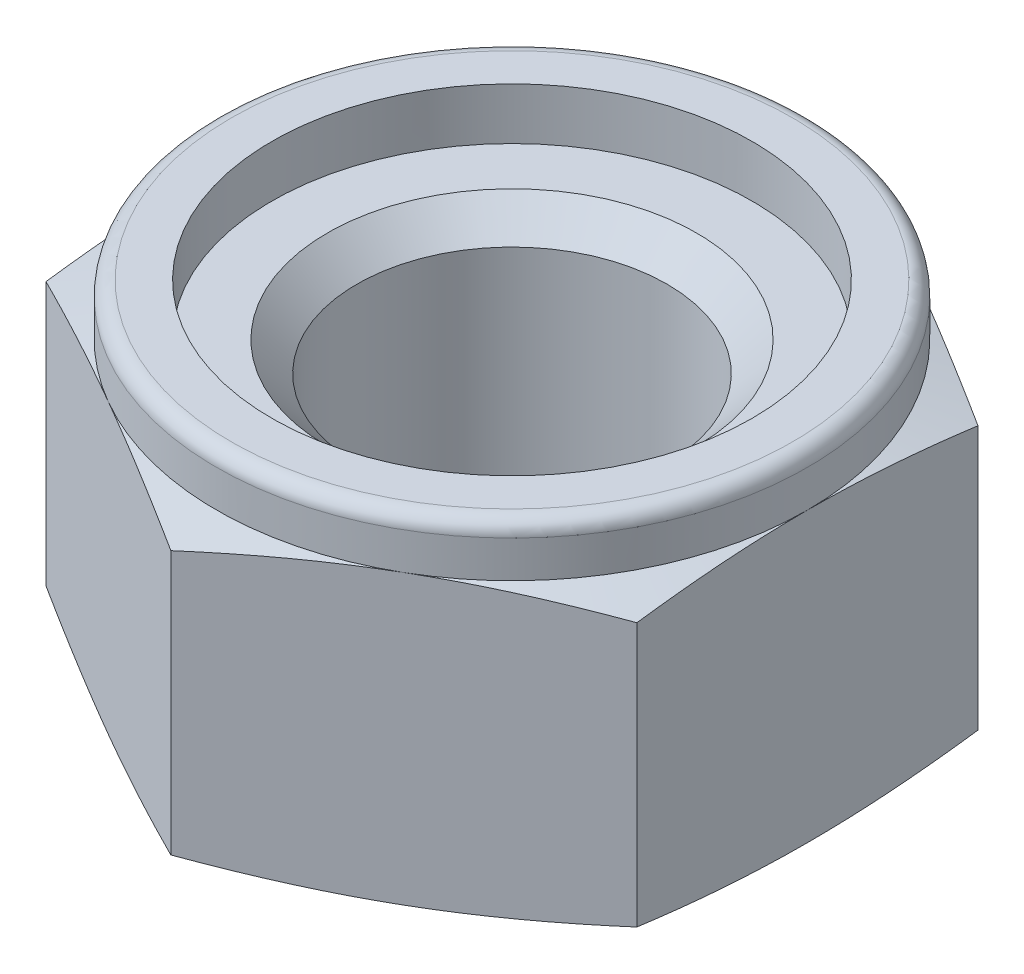
ISO-10303-21;
HEADER;
FILE_DESCRIPTION(('STEP AP214'),'2;1');
FILE_NAME('part.step','',(''),(''),'','','');
FILE_SCHEMA(('AUTOMOTIVE_DESIGN { 1 0 10303 214 1 1 1 1 }'));
ENDSEC;
DATA;
#1=APPLICATION_CONTEXT('core data for automotive mechanical design processes');
#2=APPLICATION_PROTOCOL_DEFINITION('international standard','automotive_design',2000,#1);
#3=PRODUCT_CONTEXT('',#1,'mechanical');
#4=PRODUCT('Part','Part','',(#3));
#5=PRODUCT_RELATED_PRODUCT_CATEGORY('part','',(#4));
#6=PRODUCT_DEFINITION_FORMATION('','',#4);
#7=PRODUCT_DEFINITION_CONTEXT('part definition',#1,'design');
#8=PRODUCT_DEFINITION('design','',#6,#7);
#9=PRODUCT_DEFINITION_SHAPE('','',#8);
#10=(LENGTH_UNIT() NAMED_UNIT(*) SI_UNIT(.MILLI.,.METRE.));
#11=(NAMED_UNIT(*) PLANE_ANGLE_UNIT() SI_UNIT($,.RADIAN.));
#12=(NAMED_UNIT(*) SI_UNIT($,.STERADIAN.) SOLID_ANGLE_UNIT());
#13=UNCERTAINTY_MEASURE_WITH_UNIT(LENGTH_MEASURE(1.E-05),#10,'distance_accuracy_value','');
#14=(GEOMETRIC_REPRESENTATION_CONTEXT(3) GLOBAL_UNCERTAINTY_ASSIGNED_CONTEXT((#13)) GLOBAL_UNIT_ASSIGNED_CONTEXT((#10,
#11,#12)) REPRESENTATION_CONTEXT('',''));
#15=CARTESIAN_POINT('',(0.,0.,0.));
#16=DIRECTION('',(0.,0.,1.));
#17=DIRECTION('',(1.,0.,0.));
#18=AXIS2_PLACEMENT_3D('',#15,#16,#17);
#19=CARTESIAN_POINT('',(4.,-3.9,-2.3094010767585));
#20=DIRECTION('',(0.5,0.,-0.866025403784439));
#21=DIRECTION('',(-0.866025403784439,0.,-0.5));
#22=AXIS2_PLACEMENT_3D('',#19,#20,#21);
#23=PLANE('',#22);
#24=DIRECTION('',(0.,1.,0.));
#25=VECTOR('',#24,1.);
#26=CARTESIAN_POINT('',(4.,-3.9,-2.3094010767585));
#27=LINE('',#26,#25);
#28=CARTESIAN_POINT('',(4.,-3.73419246269048,-2.3094010767585));
#29=VERTEX_POINT('',#28);
#30=CARTESIAN_POINT('',(4.,-0.165807537309517,-2.3094010767585));
#31=VERTEX_POINT('',#30);
#32=EDGE_CURVE('E159',#29,#31,#27,.T.);
#33=ORIENTED_EDGE('',*,*,#32,.F.);
#34=CARTESIAN_POINT('',(4.0002,-3.73416152142258,-2.30928560670467));
#35=CARTESIAN_POINT('',(3.83407348847834,-3.75987303025889,-2.40519879285123));
#36=CARTESIAN_POINT('',(3.66764575680637,-3.78321489853114,-2.50128588853266));
#37=CARTESIAN_POINT('',(3.33420250101888,-3.8242244457158,-2.69379944202103));
#38=CARTESIAN_POINT('',(3.16718676589026,-3.84188981954164,-2.79022602165644));
#39=CARTESIAN_POINT('',(2.83358019221101,-3.87051501923542,-2.98283386677359));
#40=CARTESIAN_POINT('',(2.66699160984345,-3.88150898419454,-3.07901382964742));
#41=CARTESIAN_POINT('',(2.33360198674029,-3.89625077349233,-3.27149641829105));
#42=CARTESIAN_POINT('',(2.16680099337015,-3.9,-3.3677990167144));
#43=CARTESIAN_POINT('',(1.83319900662985,-3.9,-3.56040421356111));
#44=CARTESIAN_POINT('',(1.66639801325971,-3.89625077349233,-3.65670681198446));
#45=CARTESIAN_POINT('',(1.33300839015655,-3.88150898419454,-3.84918940062809));
#46=CARTESIAN_POINT('',(1.16641980778899,-3.87051501923542,-3.94536936350192));
#47=CARTESIAN_POINT('',(0.832813234109738,-3.84188981954164,-4.13797720861907));
#48=CARTESIAN_POINT('',(0.665797498981121,-3.8242244457158,-4.23440378825448));
#49=CARTESIAN_POINT('',(0.332354243193628,-3.78321489853114,-4.42691734174285));
#50=CARTESIAN_POINT('',(0.165926511521663,-3.75987303025889,-4.52300443742428));
#51=CARTESIAN_POINT('',(-0.000199999999999005,-3.73416152142258,-4.61891762357084));
#52=B_SPLINE_CURVE_WITH_KNOTS('',3,(#34,#35,#36,#37,#38,#39,#40,#41,#42,#43,#44,#45,#46,#47,#48,
#49,#50,#51),.UNSPECIFIED.,.F.,.F.,(4,2,2,2,2,2,2,2,4),(0.,0.580655908162846,1.1615473094924,
1.73944052622642,2.31722188451987,2.89500324281333,3.47289645954735,4.0537878608769,
4.63444376903975),.UNSPECIFIED.);
#53=CARTESIAN_POINT('',(2.,-3.9,-3.46410161513775));
#54=VERTEX_POINT('',#53);
#55=EDGE_CURVE('E272',#29,#54,#52,.T.);
#56=ORIENTED_EDGE('',*,*,#55,.T.);
#57=CARTESIAN_POINT('',(0.,-3.73419246269048,-4.61880215351701));
#58=VERTEX_POINT('',#57);
#59=EDGE_CURVE('E57',#54,#58,#52,.T.);
#60=ORIENTED_EDGE('',*,*,#59,.T.);
#61=DIRECTION('',(0.,1.,0.));
#62=VECTOR('',#61,1.);
#63=CARTESIAN_POINT('',(0.,-3.9,-4.61880215351701));
#64=LINE('',#63,#62);
#65=CARTESIAN_POINT('',(0.,-0.165807537309517,-4.61880215351701));
#66=VERTEX_POINT('',#65);
#67=EDGE_CURVE('E390',#58,#66,#64,.T.);
#68=ORIENTED_EDGE('',*,*,#67,.T.);
#69=CARTESIAN_POINT('',(-0.000199999999999999,-0.165838478577418,-4.61891762357084));
#70=CARTESIAN_POINT('',(0.165926511521663,-0.140126969741107,-4.52300443742428));
#71=CARTESIAN_POINT('',(0.332354243193627,-0.116785101468864,-4.42691734174285));
#72=CARTESIAN_POINT('',(0.66579749898112,-0.075775554284197,-4.23440378825448));
#73=CARTESIAN_POINT('',(0.832813234109737,-0.0581101804583608,-4.13797720861907));
#74=CARTESIAN_POINT('',(1.16641980778899,-0.0294849807645812,-3.94536936350192));
#75=CARTESIAN_POINT('',(1.33300839015655,-0.01849101580546,-3.84918940062809));
#76=CARTESIAN_POINT('',(1.66639801325971,-0.00374922650766884,-3.65670681198446));
#77=CARTESIAN_POINT('',(1.83319900662985,0.,-3.56040421356111));
#78=CARTESIAN_POINT('',(2.16680099337015,0.,-3.3677990167144));
#79=CARTESIAN_POINT('',(2.33360198674029,-0.00374922650766877,-3.27149641829105));
#80=CARTESIAN_POINT('',(2.66699160984345,-0.0184910158054601,-3.07901382964742));
#81=CARTESIAN_POINT('',(2.83358019221101,-0.0294849807645813,-2.98283386677359));
#82=CARTESIAN_POINT('',(3.16718676589026,-0.0581101804583608,-2.79022602165644));
#83=CARTESIAN_POINT('',(3.33420250101888,-0.0757755542841968,-2.69379944202103));
#84=CARTESIAN_POINT('',(3.66764575680637,-0.116785101468864,-2.50128588853266));
#85=CARTESIAN_POINT('',(3.83407348847834,-0.140126969741107,-2.40519879285123));
#86=CARTESIAN_POINT('',(4.0002,-0.165838478577418,-2.30928560670467));
#87=B_SPLINE_CURVE_WITH_KNOTS('',3,(#69,#70,#71,#72,#73,#74,#75,#76,#77,#78,#79,#80,#81,#82,#83,
#84,#85,#86),.UNSPECIFIED.,.F.,.F.,(4,2,2,2,2,2,2,2,4),(0.,0.580655908162845,1.1615473094924,
1.73944052622642,2.31722188451987,2.89500324281333,3.47289645954735,4.0537878608769,
4.63444376903975),.UNSPECIFIED.);
#88=CARTESIAN_POINT('',(2.,0.,-3.46410161513775));
#89=VERTEX_POINT('',#88);
#90=EDGE_CURVE('E394',#66,#89,#87,.T.);
#91=ORIENTED_EDGE('',*,*,#90,.T.);
#92=EDGE_CURVE('E236',#89,#31,#87,.T.);
#93=ORIENTED_EDGE('',*,*,#92,.T.);
#94=EDGE_LOOP('',(#33,#56,#60,#68,#91,#93));
#95=FACE_BOUND('',#94,.T.);
#96=ADVANCED_FACE('F34',(#95),#23,.T.);
#97=CARTESIAN_POINT('',(4.,-3.9,2.3094010767585));
#98=DIRECTION('',(1.,0.,0.));
#99=DIRECTION('',(0.,0.,-1.));
#100=AXIS2_PLACEMENT_3D('',#97,#98,#99);
#101=PLANE('',#100);
#102=DIRECTION('',(0.,1.,0.));
#103=VECTOR('',#102,1.);
#104=CARTESIAN_POINT('',(4.,-3.9,2.3094010767585));
#105=LINE('',#104,#103);
#106=CARTESIAN_POINT('',(4.,-3.73419246269048,2.3094010767585));
#107=VERTEX_POINT('',#106);
#108=CARTESIAN_POINT('',(4.,-0.165807537309517,2.3094010767585));
#109=VERTEX_POINT('',#108);
#110=EDGE_CURVE('E131',#107,#109,#105,.T.);
#111=ORIENTED_EDGE('',*,*,#110,.F.);
#112=CARTESIAN_POINT('',(4.,-3.01595436953709,-6.10572086967074));
#113=CARTESIAN_POINT('',(4.,-3.05660785735266,-5.92429195794968));
#114=CARTESIAN_POINT('',(4.,-3.09676352877632,-5.74274954448039));
#115=CARTESIAN_POINT('',(4.,-3.17581062764326,-5.37938179680373));
#116=CARTESIAN_POINT('',(4.,-3.21470200037727,-5.19755645070899));
#117=CARTESIAN_POINT('',(4.,-3.29098583436686,-4.83340356135566));
#118=CARTESIAN_POINT('',(4.,-3.32837678341218,-4.65107570002296));
#119=CARTESIAN_POINT('',(4.,-3.40125525116772,-4.28604081191113));
#120=CARTESIAN_POINT('',(4.,-3.43674278597926,-4.10333378835298));
#121=CARTESIAN_POINT('',(4.,-3.50508822796062,-3.7389341343721));
#122=CARTESIAN_POINT('',(4.,-3.53796487116613,-3.55724505452428));
#123=CARTESIAN_POINT('',(4.,-3.60084155618723,-3.19337101971837));
#124=CARTESIAN_POINT('',(4.,-3.63084153129402,-3.01118605336155));
#125=CARTESIAN_POINT('',(4.,-3.71553129311669,-2.46383466451405));
#126=CARTESIAN_POINT('',(4.,-3.76492626374174,-2.09779291779679));
#127=CARTESIAN_POINT('',(4.,-3.8237333221464,-1.54498382603051));
#128=CARTESIAN_POINT('',(4.,-3.84084036468772,-1.35903266205509));
#129=CARTESIAN_POINT('',(4.,-3.86891366340535,-0.98666058237755));
#130=CARTESIAN_POINT('',(4.,-3.87988006040593,-0.800239677546552));
#131=CARTESIAN_POINT('',(4.,-3.89503571158575,-0.427202275547508));
#132=CARTESIAN_POINT('',(4.,-3.89922803288611,-0.240585905201729));
#133=CARTESIAN_POINT('',(4.,-3.90057695539164,0.13267284679997));
#134=CARTESIAN_POINT('',(4.,-3.89773356203681,0.319315228435666));
#135=CARTESIAN_POINT('',(4.,-3.88517131437763,0.693042882706222));
#136=CARTESIAN_POINT('',(4.,-3.87542750710641,0.880127299337181));
#137=CARTESIAN_POINT('',(4.,-3.84961980757283,1.25385559678635));
#138=CARTESIAN_POINT('',(4.,-3.83355577563893,1.44049946777717));
#139=CARTESIAN_POINT('',(4.,-3.79591975441154,1.81334570885039));
#140=CARTESIAN_POINT('',(4.,-3.7743441782302,1.99954771141548));
#141=CARTESIAN_POINT('',(4.,-3.72657602247871,2.3713510683107));
#142=CARTESIAN_POINT('',(4.,-3.70038342844518,2.55695242075736));
#143=CARTESIAN_POINT('',(4.,-3.61993667757263,3.08801452869602));
#144=CARTESIAN_POINT('',(4.,-3.56101970063747,3.43276550882737));
#145=CARTESIAN_POINT('',(4.,-3.43447150147252,4.12066388789736));
#146=CARTESIAN_POINT('',(4.,-3.36683917924609,4.46381107874073));
#147=CARTESIAN_POINT('',(4.,-3.22572117492553,5.14897682868291));
#148=CARTESIAN_POINT('',(4.,-3.1522340857243,5.49099509576764));
#149=CARTESIAN_POINT('',(4.,-3.00127531383369,6.17412330332495));
#150=CARTESIAN_POINT('',(4.,-2.92380386316252,6.51523329547449));
#151=CARTESIAN_POINT('',(4.,-2.7668350397813,7.19345355269296));
#152=CARTESIAN_POINT('',(4.,-2.68736505870511,7.53057018098002));
#153=CARTESIAN_POINT('',(4.,-2.52643428963016,8.20433309468715));
#154=CARTESIAN_POINT('',(4.,-2.44497346551579,8.54097937145737));
#155=CARTESIAN_POINT('',(4.,-2.28068211666776,9.2134980758963));
#156=CARTESIAN_POINT('',(4.,-2.19785339959774,9.54937094609798));
#157=CARTESIAN_POINT('',(4.,-2.03106409319372,10.2208239916289));
#158=CARTESIAN_POINT('',(4.,-1.94710354121405,10.5564041762304));
#159=CARTESIAN_POINT('',(4.,-1.86274197746043,10.8918823132006));
#160=B_SPLINE_CURVE_WITH_KNOTS('',3,(#112,#113,#114,#115,#116,#117,#118,#119,#120,#121,#122,
#123,#124,#125,#126,#127,#128,#129,#130,#131,#132,#133,#134,#135,#136,#137,#138,#139,#140,#141,
#142,#143,#144,#145,#146,#147,#148,#149,#150,#151,#152,#153,#154,#155,#156,#157,#158,#159),
.UNSPECIFIED.,.F.,.F.,(4,2,2,2,2,2,2,2,2,2,2,2,2,2,2,2,2,2,2,2,2,2,2,4),(0.,0.557785590390607,
1.11559528547674,1.67395373237497,2.23230745527376,2.78620241183816,3.34011020990258,
4.44768496330763,5.00781204660614,5.56792628390682,6.12778684525911,6.68764697372795,
7.24954204974875,7.81144954386674,8.37372366061136,8.93599953878234,9.98505029876087,
11.0342335933171,12.0836698087356,13.1330449821946,14.1721075065401,15.2111888943826,
16.2489924174028,17.2867617728858),.UNSPECIFIED.);
#161=CARTESIAN_POINT('',(4.,-3.9,0.));
#162=VERTEX_POINT('',#161);
#163=EDGE_CURVE('E252',#107,#162,#160,.F.);
#164=ORIENTED_EDGE('',*,*,#163,.T.);
#165=EDGE_CURVE('E49',#162,#29,#160,.F.);
#166=ORIENTED_EDGE('',*,*,#165,.T.);
#167=ORIENTED_EDGE('',*,*,#32,.T.);
#168=CARTESIAN_POINT('',(4.,-0.884045630462912,-6.10572086967074));
#169=CARTESIAN_POINT('',(4.,-0.84339214264734,-5.92429195794968));
#170=CARTESIAN_POINT('',(4.,-0.803236471223681,-5.74274954448039));
#171=CARTESIAN_POINT('',(4.,-0.724189372356739,-5.37938179680373));
#172=CARTESIAN_POINT('',(4.,-0.685297999622734,-5.19755645070899));
#173=CARTESIAN_POINT('',(4.,-0.609014165633139,-4.83340356135566));
#174=CARTESIAN_POINT('',(4.,-0.571623216587816,-4.65107570002296));
#175=CARTESIAN_POINT('',(4.,-0.49874474883228,-4.28604081191113));
#176=CARTESIAN_POINT('',(4.,-0.463257214020743,-4.10333378835298));
#177=CARTESIAN_POINT('',(4.,-0.394911772039382,-3.73893413437209));
#178=CARTESIAN_POINT('',(4.,-0.362035128833869,-3.55724505452428));
#179=CARTESIAN_POINT('',(4.,-0.299158443812768,-3.19337101971836));
#180=CARTESIAN_POINT('',(4.,-0.269158468705975,-3.01118605336155));
#181=CARTESIAN_POINT('',(4.,-0.184468706883313,-2.46383466451405));
#182=CARTESIAN_POINT('',(4.,-0.135073736258261,-2.09779291779679));
#183=CARTESIAN_POINT('',(4.,-0.0762666778535951,-1.54498382603051));
#184=CARTESIAN_POINT('',(4.,-0.0591596353122783,-1.35903266205509));
#185=CARTESIAN_POINT('',(4.,-0.0310863365946526,-0.986660582377549));
#186=CARTESIAN_POINT('',(4.,-0.0201199395940722,-0.800239677546551));
#187=CARTESIAN_POINT('',(4.,-0.00496428841424819,-0.427202275547507));
#188=CARTESIAN_POINT('',(4.,-0.000771967113889668,-0.240585905201728));
#189=CARTESIAN_POINT('',(4.,0.000576955391637953,0.13267284679997));
#190=CARTESIAN_POINT('',(4.,-0.00226643796318603,0.319315228435666));
#191=CARTESIAN_POINT('',(4.,-0.0148286856223665,0.693042882706222));
#192=CARTESIAN_POINT('',(4.,-0.0245724928935937,0.880127299337181));
#193=CARTESIAN_POINT('',(4.,-0.0503801924271709,1.25385559678635));
#194=CARTESIAN_POINT('',(4.,-0.0664442243610698,1.44049946777717));
#195=CARTESIAN_POINT('',(4.,-0.104080245588456,1.81334570885039));
#196=CARTESIAN_POINT('',(4.,-0.125655821769801,1.99954771141548));
#197=CARTESIAN_POINT('',(4.,-0.173423977521286,2.3713510683107));
#198=CARTESIAN_POINT('',(4.,-0.199616571554821,2.55695242075736));
#199=CARTESIAN_POINT('',(4.,-0.280063322427368,3.08801452869602));
#200=CARTESIAN_POINT('',(4.,-0.338980299362527,3.43276550882737));
#201=CARTESIAN_POINT('',(4.,-0.465528498527482,4.12066388789736));
#202=CARTESIAN_POINT('',(4.,-0.533160820753915,4.46381107874074));
#203=CARTESIAN_POINT('',(4.,-0.674278825074474,5.14897682868291));
#204=CARTESIAN_POINT('',(4.,-0.747765914275703,5.49099509576764));
#205=CARTESIAN_POINT('',(4.,-0.898724686166315,6.17412330332496));
#206=CARTESIAN_POINT('',(4.,-0.976196136837483,6.51523329547449));
#207=CARTESIAN_POINT('',(4.,-1.1331649602187,7.19345355269297));
#208=CARTESIAN_POINT('',(4.,-1.21263494129489,7.53057018098002));
#209=CARTESIAN_POINT('',(4.,-1.37356571036985,8.20433309468715));
#210=CARTESIAN_POINT('',(4.,-1.45502653448421,8.54097937145737));
#211=CARTESIAN_POINT('',(4.,-1.61931788333225,9.2134980758963));
#212=CARTESIAN_POINT('',(4.,-1.70214660040226,9.54937094609798));
#213=CARTESIAN_POINT('',(4.,-1.86893590680628,10.2208239916289));
#214=CARTESIAN_POINT('',(4.,-1.95289645878595,10.5564041762304));
#215=CARTESIAN_POINT('',(4.,-2.03725802253957,10.8918823132006));
#216=B_SPLINE_CURVE_WITH_KNOTS('',3,(#168,#169,#170,#171,#172,#173,#174,#175,#176,#177,#178,
#179,#180,#181,#182,#183,#184,#185,#186,#187,#188,#189,#190,#191,#192,#193,#194,#195,#196,#197,
#198,#199,#200,#201,#202,#203,#204,#205,#206,#207,#208,#209,#210,#211,#212,#213,#214,#215),
.UNSPECIFIED.,.F.,.F.,(4,2,2,2,2,2,2,2,2,2,2,2,2,2,2,2,2,2,2,2,2,2,2,4),(0.,0.557785590390607,
1.11559528547675,1.67395373237497,2.23230745527376,2.78620241183816,3.34011020990258,
4.44768496330763,5.00781204660614,5.56792628390682,6.12778684525911,6.68764697372795,
7.24954204974875,7.81144954386674,8.37372366061136,8.93599953878234,9.98505029876087,
11.0342335933171,12.0836698087356,13.1330449821946,14.1721075065401,15.2111888943826,
16.2489924174028,17.2867617728858),.UNSPECIFIED.);
#217=CARTESIAN_POINT('',(4.,0.,0.));
#218=VERTEX_POINT('',#217);
#219=EDGE_CURVE('E235',#31,#218,#216,.T.);
#220=ORIENTED_EDGE('',*,*,#219,.T.);
#221=EDGE_CURVE('E135',#218,#109,#216,.T.);
#222=ORIENTED_EDGE('',*,*,#221,.T.);
#223=EDGE_LOOP('',(#111,#164,#166,#167,#220,#222));
#224=FACE_BOUND('',#223,.T.);
#225=ADVANCED_FACE('F240',(#224),#101,.T.);
#226=CARTESIAN_POINT('',(0.,-3.9,4.618802153517));
#227=DIRECTION('',(0.5,0.,0.866025403784439));
#228=DIRECTION('',(0.866025403784439,0.,-0.5));
#229=AXIS2_PLACEMENT_3D('',#226,#227,#228);
#230=PLANE('',#229);
#231=DIRECTION('',(0.,1.,0.));
#232=VECTOR('',#231,1.);
#233=CARTESIAN_POINT('',(0.,-3.9,4.618802153517));
#234=LINE('',#233,#232);
#235=CARTESIAN_POINT('',(0.,-3.73419246269048,4.61880215351701));
#236=VERTEX_POINT('',#235);
#237=CARTESIAN_POINT('',(0.,-0.165807537309517,4.61880215351701));
#238=VERTEX_POINT('',#237);
#239=EDGE_CURVE('E392',#236,#238,#234,.T.);
#240=ORIENTED_EDGE('',*,*,#239,.F.);
#241=CARTESIAN_POINT('',(-0.000200000000001787,-3.73416152142258,4.61891762357084));
#242=CARTESIAN_POINT('',(0.165926511521661,-3.75987303025889,4.52300443742428));
#243=CARTESIAN_POINT('',(0.332354243193626,-3.78321489853114,4.42691734174285));
#244=CARTESIAN_POINT('',(0.665797498981118,-3.8242244457158,4.23440378825448));
#245=CARTESIAN_POINT('',(0.832813234109735,-3.84188981954164,4.13797720861907));
#246=CARTESIAN_POINT('',(1.16641980778899,-3.87051501923542,3.94536936350192));
#247=CARTESIAN_POINT('',(1.33300839015655,-3.88150898419454,3.84918940062809));
#248=CARTESIAN_POINT('',(1.66639801325971,-3.89625077349233,3.65670681198446));
#249=CARTESIAN_POINT('',(1.83319900662985,-3.9,3.5604042135611));
#250=CARTESIAN_POINT('',(2.16680099337015,-3.9,3.3677990167144));
#251=CARTESIAN_POINT('',(2.33360198674029,-3.89625077349233,3.27149641829105));
#252=CARTESIAN_POINT('',(2.66699160984345,-3.88150898419454,3.07901382964742));
#253=CARTESIAN_POINT('',(2.83358019221101,-3.87051501923542,2.98283386677359));
#254=CARTESIAN_POINT('',(3.16718676589026,-3.84188981954164,2.79022602165644));
#255=CARTESIAN_POINT('',(3.33420250101888,-3.8242244457158,2.69379944202103));
#256=CARTESIAN_POINT('',(3.66764575680637,-3.78321489853114,2.50128588853266));
#257=CARTESIAN_POINT('',(3.83407348847834,-3.75987303025889,2.40519879285123));
#258=CARTESIAN_POINT('',(4.0002,-3.73416152142258,2.30928560670467));
#259=B_SPLINE_CURVE_WITH_KNOTS('',3,(#241,#242,#243,#244,#245,#246,#247,#248,#249,#250,#251,
#252,#253,#254,#255,#256,#257,#258),.UNSPECIFIED.,.F.,.F.,(4,2,2,2,2,2,2,2,4),(0.,
0.580655908162845,1.1615473094924,1.73944052622642,2.31722188451988,2.89500324281333,
3.47289645954735,4.0537878608769,4.63444376903975),.UNSPECIFIED.);
#260=CARTESIAN_POINT('',(2.,-3.9,3.46410161513776));
#261=VERTEX_POINT('',#260);
#262=EDGE_CURVE('E152',#236,#261,#259,.T.);
#263=ORIENTED_EDGE('',*,*,#262,.T.);
#264=EDGE_CURVE('E258',#261,#107,#259,.T.);
#265=ORIENTED_EDGE('',*,*,#264,.T.);
#266=ORIENTED_EDGE('',*,*,#110,.T.);
#267=CARTESIAN_POINT('',(4.0002,-0.165838478577418,2.30928560670467));
#268=CARTESIAN_POINT('',(3.83407348847834,-0.140126969741107,2.40519879285123));
#269=CARTESIAN_POINT('',(3.66764575680637,-0.116785101468863,2.50128588853266));
#270=CARTESIAN_POINT('',(3.33420250101888,-0.0757755542841966,2.69379944202103));
#271=CARTESIAN_POINT('',(3.16718676589026,-0.0581101804583607,2.79022602165644));
#272=CARTESIAN_POINT('',(2.83358019221101,-0.0294849807645811,2.98283386677359));
#273=CARTESIAN_POINT('',(2.66699160984345,-0.0184910158054597,3.07901382964742));
#274=CARTESIAN_POINT('',(2.33360198674029,-0.00374922650766824,3.27149641829105));
#275=CARTESIAN_POINT('',(2.16680099337015,0.,3.3677990167144));
#276=CARTESIAN_POINT('',(1.83319900662985,0.,3.5604042135611));
#277=CARTESIAN_POINT('',(1.66639801325971,-0.0037492265076684,3.65670681198446));
#278=CARTESIAN_POINT('',(1.33300839015655,-0.0184910158054597,3.84918940062809));
#279=CARTESIAN_POINT('',(1.16641980778899,-0.0294849807645809,3.94536936350192));
#280=CARTESIAN_POINT('',(0.832813234109736,-0.0581101804583603,4.13797720861907));
#281=CARTESIAN_POINT('',(0.665797498981119,-0.0757755542841963,4.23440378825448));
#282=CARTESIAN_POINT('',(0.332354243193626,-0.116785101468863,4.42691734174285));
#283=CARTESIAN_POINT('',(0.165926511521661,-0.140126969741107,4.52300443742428));
#284=CARTESIAN_POINT('',(-0.00020000000000141,-0.165838478577418,4.61891762357084));
#285=B_SPLINE_CURVE_WITH_KNOTS('',3,(#267,#268,#269,#270,#271,#272,#273,#274,#275,#276,#277,
#278,#279,#280,#281,#282,#283,#284),.UNSPECIFIED.,.F.,.F.,(4,2,2,2,2,2,2,2,4),(0.,
0.580655908162846,1.1615473094924,1.73944052622642,2.31722188451988,2.89500324281333,
3.47289645954735,4.0537878608769,4.63444376903975),.UNSPECIFIED.);
#286=CARTESIAN_POINT('',(2.,0.,3.46410161513776));
#287=VERTEX_POINT('',#286);
#288=EDGE_CURVE('E124',#109,#287,#285,.T.);
#289=ORIENTED_EDGE('',*,*,#288,.T.);
#290=EDGE_CURVE('E128',#287,#238,#285,.T.);
#291=ORIENTED_EDGE('',*,*,#290,.T.);
#292=EDGE_LOOP('',(#240,#263,#265,#266,#289,#291));
#293=FACE_BOUND('',#292,.T.);
#294=ADVANCED_FACE('F127',(#293),#230,.T.);
#295=CARTESIAN_POINT('',(-4.,-3.9,2.3094010767585));
#296=DIRECTION('',(-0.5,0.,0.866025403784438));
#297=DIRECTION('',(0.866025403784439,0.,0.5));
#298=AXIS2_PLACEMENT_3D('',#295,#296,#297);
#299=PLANE('',#298);
#300=DIRECTION('',(0.,1.,0.));
#301=VECTOR('',#300,1.);
#302=CARTESIAN_POINT('',(-4.,-3.9,2.3094010767585));
#303=LINE('',#302,#301);
#304=CARTESIAN_POINT('',(-4.,-3.73419246269048,2.3094010767585));
#305=VERTEX_POINT('',#304);
#306=CARTESIAN_POINT('',(-4.,-0.165807537309517,2.3094010767585));
#307=VERTEX_POINT('',#306);
#308=EDGE_CURVE('E389',#305,#307,#303,.T.);
#309=ORIENTED_EDGE('',*,*,#308,.F.);
#310=CARTESIAN_POINT('',(-4.0002,-3.73416152142258,2.30928560670466));
#311=CARTESIAN_POINT('',(-3.83407348847834,-3.75987303025889,2.40519879285123));
#312=CARTESIAN_POINT('',(-3.66764575680637,-3.78321489853114,2.50128588853266));
#313=CARTESIAN_POINT('',(-3.33420250101888,-3.8242244457158,2.69379944202103));
#314=CARTESIAN_POINT('',(-3.16718676589026,-3.84188981954164,2.79022602165644));
#315=CARTESIAN_POINT('',(-2.83358019221101,-3.87051501923542,2.98283386677359));
#316=CARTESIAN_POINT('',(-2.66699160984345,-3.88150898419454,3.07901382964742));
#317=CARTESIAN_POINT('',(-2.33360198674029,-3.89625077349233,3.27149641829105));
#318=CARTESIAN_POINT('',(-2.16680099337015,-3.9,3.3677990167144));
#319=CARTESIAN_POINT('',(-1.83319900662985,-3.9,3.5604042135611));
#320=CARTESIAN_POINT('',(-1.66639801325971,-3.89625077349233,3.65670681198446));
#321=CARTESIAN_POINT('',(-1.33300839015655,-3.88150898419454,3.84918940062809));
#322=CARTESIAN_POINT('',(-1.16641980778899,-3.87051501923542,3.94536936350192));
#323=CARTESIAN_POINT('',(-0.832813234109739,-3.84188981954164,4.13797720861907));
#324=CARTESIAN_POINT('',(-0.665797498981122,-3.8242244457158,4.23440378825448));
#325=CARTESIAN_POINT('',(-0.332354243193629,-3.78321489853114,4.42691734174285));
#326=CARTESIAN_POINT('',(-0.165926511521665,-3.75987303025889,4.52300443742428));
#327=CARTESIAN_POINT('',(0.000199999999997752,-3.73416152142258,4.61891762357084));
#328=B_SPLINE_CURVE_WITH_KNOTS('',3,(#310,#311,#312,#313,#314,#315,#316,#317,#318,#319,#320,
#321,#322,#323,#324,#325,#326,#327),.UNSPECIFIED.,.F.,.F.,(4,2,2,2,2,2,2,2,4),(0.,
0.580655908162845,1.1615473094924,1.73944052622642,2.31722188451987,2.89500324281333,
3.47289645954735,4.0537878608769,4.63444376903975),.UNSPECIFIED.);
#329=CARTESIAN_POINT('',(-2.,-3.9,3.46410161513775));
#330=VERTEX_POINT('',#329);
#331=EDGE_CURVE('E253',#305,#330,#328,.T.);
#332=ORIENTED_EDGE('',*,*,#331,.T.);
#333=EDGE_CURVE('E262',#330,#236,#328,.T.);
#334=ORIENTED_EDGE('',*,*,#333,.T.);
#335=ORIENTED_EDGE('',*,*,#239,.T.);
#336=CARTESIAN_POINT('',(0.000199999999998244,-0.165838478577418,4.61891762357084));
#337=CARTESIAN_POINT('',(-0.165926511521665,-0.140126969741107,4.52300443742428));
#338=CARTESIAN_POINT('',(-0.332354243193629,-0.116785101468864,4.42691734174285));
#339=CARTESIAN_POINT('',(-0.665797498981122,-0.0757755542841967,4.23440378825448));
#340=CARTESIAN_POINT('',(-0.832813234109739,-0.0581101804583606,4.13797720861907));
#341=CARTESIAN_POINT('',(-1.16641980778899,-0.0294849807645811,3.94536936350192));
#342=CARTESIAN_POINT('',(-1.33300839015655,-0.0184910158054597,3.84918940062809));
#343=CARTESIAN_POINT('',(-1.66639801325971,-0.00374922650766844,3.65670681198446));
#344=CARTESIAN_POINT('',(-1.83319900662985,0.,3.5604042135611));
#345=CARTESIAN_POINT('',(-2.16680099337015,0.,3.3677990167144));
#346=CARTESIAN_POINT('',(-2.33360198674029,-0.00374922650766864,3.27149641829105));
#347=CARTESIAN_POINT('',(-2.66699160984345,-0.01849101580546,3.07901382964742));
#348=CARTESIAN_POINT('',(-2.83358019221101,-0.0294849807645813,2.98283386677359));
#349=CARTESIAN_POINT('',(-3.16718676589026,-0.0581101804583608,2.79022602165644));
#350=CARTESIAN_POINT('',(-3.33420250101888,-0.0757755542841969,2.69379944202103));
#351=CARTESIAN_POINT('',(-3.66764575680637,-0.116785101468864,2.50128588853266));
#352=CARTESIAN_POINT('',(-3.83407348847834,-0.140126969741107,2.40519879285123));
#353=CARTESIAN_POINT('',(-4.0002,-0.165838478577418,2.30928560670466));
#354=B_SPLINE_CURVE_WITH_KNOTS('',3,(#336,#337,#338,#339,#340,#341,#342,#343,#344,#345,#346,
#347,#348,#349,#350,#351,#352,#353),.UNSPECIFIED.,.F.,.F.,(4,2,2,2,2,2,2,2,4),(0.,
0.580655908162845,1.1615473094924,1.73944052622642,2.31722188451987,2.89500324281333,
3.47289645954735,4.0537878608769,4.63444376903975),.UNSPECIFIED.);
#355=CARTESIAN_POINT('',(-2.,0.,3.46410161513775));
#356=VERTEX_POINT('',#355);
#357=EDGE_CURVE('E144',#238,#356,#354,.T.);
#358=ORIENTED_EDGE('',*,*,#357,.T.);
#359=EDGE_CURVE('E221',#356,#307,#354,.T.);
#360=ORIENTED_EDGE('',*,*,#359,.T.);
#361=EDGE_LOOP('',(#309,#332,#334,#335,#358,#360));
#362=FACE_BOUND('',#361,.T.);
#363=ADVANCED_FACE('F380',(#362),#299,.T.);
#364=CARTESIAN_POINT('',(-4.,-3.9,-2.3094010767585));
#365=DIRECTION('',(-1.,0.,0.));
#366=DIRECTION('',(0.,0.,1.));
#367=AXIS2_PLACEMENT_3D('',#364,#365,#366);
#368=PLANE('',#367);
#369=DIRECTION('',(0.,1.,0.));
#370=VECTOR('',#369,1.);
#371=CARTESIAN_POINT('',(-4.,-3.9,-2.3094010767585));
#372=LINE('',#371,#370);
#373=CARTESIAN_POINT('',(-4.,-3.73419246269048,-2.3094010767585));
#374=VERTEX_POINT('',#373);
#375=CARTESIAN_POINT('',(-4.,-0.165807537309517,-2.3094010767585));
#376=VERTEX_POINT('',#375);
#377=EDGE_CURVE('E187',#374,#376,#372,.T.);
#378=ORIENTED_EDGE('',*,*,#377,.F.);
#379=CARTESIAN_POINT('',(-4.,-3.01595446137486,-6.10572045992604));
#380=CARTESIAN_POINT('',(-4.,-3.05660794466169,-5.92429156476436));
#381=CARTESIAN_POINT('',(-4.,-3.09676361157307,-5.74274916786053));
#382=CARTESIAN_POINT('',(-4.,-3.17581070148241,-5.37938145333641));
#383=CARTESIAN_POINT('',(-4.,-3.2147020697711,-5.19755612382875));
#384=CARTESIAN_POINT('',(-4.,-3.29098589495891,-4.83340326773456));
#385=CARTESIAN_POINT('',(-4.,-3.3283768396482,-4.65107542307401));
#386=CARTESIAN_POINT('',(-4.,-3.40125529885012,-4.28604056834793));
#387=CARTESIAN_POINT('',(-4.,-3.43674282946407,-4.10333356150337));
#388=CARTESIAN_POINT('',(-4.,-3.50508826337908,-3.73893394056794));
#389=CARTESIAN_POINT('',(-4.,-3.53796490271002,-3.55724487705079));
#390=CARTESIAN_POINT('',(-4.,-3.60084158032241,-3.19337087497851));
#391=CARTESIAN_POINT('',(-4.,-3.63084155189507,-3.01118592502466));
#392=CARTESIAN_POINT('',(-4.,-3.71553130384887,-2.46383458550379));
#393=CARTESIAN_POINT('',(-4.,-3.7649262688661,-2.0977928718594));
#394=CARTESIAN_POINT('',(-4.,-3.82373332141355,-1.54498383179381));
#395=CARTESIAN_POINT('',(-4.,-3.84084036238859,-1.35903268629814));
#396=CARTESIAN_POINT('',(-4.,-3.86891365925639,-0.986660643662163));
#397=CARTESIAN_POINT('',(-4.,-3.87988005597331,-0.800239757392967));
#398=CARTESIAN_POINT('',(-4.,-3.89503570802083,-0.427202392510315));
#399=CARTESIAN_POINT('',(-4.,-3.89922803047135,-0.240586040719095));
#400=CARTESIAN_POINT('',(-4.,-3.90057695669299,0.132672674241278));
#401=CARTESIAN_POINT('',(-4.,-3.89773356590415,0.319315037390208));
#402=CARTESIAN_POINT('',(-4.,-3.88517132460721,0.69304265469052));
#403=CARTESIAN_POINT('',(-4.,-3.87542752113917,0.880127052838591));
#404=CARTESIAN_POINT('',(-4.,-3.84961983012789,1.25385531348811));
#405=CARTESIAN_POINT('',(-4.,-3.83355580291318,1.44049916616218));
#406=CARTESIAN_POINT('',(-4.,-3.79591979172214,1.81334537070934));
#407=CARTESIAN_POINT('',(-4.,-3.77434422085942,1.99954735506535));
#408=CARTESIAN_POINT('',(-4.,-3.72657607607488,2.37135067566498));
#409=CARTESIAN_POINT('',(-4.,-3.70038348768965,2.55695201002513));
#410=CARTESIAN_POINT('',(-4.,-3.61993674798882,3.08801410071017));
#411=CARTESIAN_POINT('',(-4.,-3.56101977545046,3.43276508157955));
#412=CARTESIAN_POINT('',(-4.,-3.43447158360646,4.1206634619541));
#413=CARTESIAN_POINT('',(-4.,-3.36683926430352,4.46381065336388));
#414=CARTESIAN_POINT('',(-4.,-3.2257212648558,5.14897640442554));
#415=CARTESIAN_POINT('',(-4.,-3.15223417760128,5.4909946720628));
#416=CARTESIAN_POINT('',(-4.,-3.00127540899713,6.17412288060126));
#417=CARTESIAN_POINT('',(-4.,-2.92380395966583,6.51523287317943));
#418=CARTESIAN_POINT('',(-4.,-2.76683513843666,7.19345313169627));
#419=CARTESIAN_POINT('',(-4.,-2.68736515817222,7.53056976085284));
#420=CARTESIAN_POINT('',(-4.,-2.52643439045649,8.20433267624307));
#421=CARTESIAN_POINT('',(-4.,-2.44497356688959,8.54097895382684));
#422=CARTESIAN_POINT('',(-4.,-2.28068221901751,9.21349765960114));
#423=CARTESIAN_POINT('',(-4.,-2.1978535023773,9.54937053032494));
#424=CARTESIAN_POINT('',(-4.,-2.03106419670615,10.2208235768665));
#425=CARTESIAN_POINT('',(-4.,-1.94710364502957,10.5564037619566));
#426=CARTESIAN_POINT('',(-4.,-1.86274208153981,10.8918818994056));
#427=B_SPLINE_CURVE_WITH_KNOTS('',3,(#379,#380,#381,#382,#383,#384,#385,#386,#387,#388,#389,
#390,#391,#392,#393,#394,#395,#396,#397,#398,#399,#400,#401,#402,#403,#404,#405,#406,#407,#408,
#409,#410,#411,#412,#413,#414,#415,#416,#417,#418,#419,#420,#421,#422,#423,#424,#425,#426),
.UNSPECIFIED.,.F.,.F.,(4,2,2,2,2,2,2,2,2,2,2,2,2,2,2,2,2,2,2,2,2,2,2,4),(0.,0.557785538943667,
1.11559518257992,1.67395357785665,2.23230724913421,2.78620215542359,3.34010990320946,
4.44768455615398,5.0078115838421,5.56792576554065,6.12778627136214,6.68764634429727,
7.2495413643779,7.81144880254854,8.37372286319782,8.93599868527465,9.98504944514669,
11.0342327396538,12.0836689554548,13.1330441292732,14.1721066555966,15.2111880454239,
16.2489915696558,17.2867609263393),.UNSPECIFIED.);
#428=CARTESIAN_POINT('',(-4.,-3.9,0.));
#429=VERTEX_POINT('',#428);
#430=EDGE_CURVE('E274',#374,#429,#427,.T.);
#431=ORIENTED_EDGE('',*,*,#430,.T.);
#432=EDGE_CURVE('E269',#429,#305,#427,.T.);
#433=ORIENTED_EDGE('',*,*,#432,.T.);
#434=ORIENTED_EDGE('',*,*,#308,.T.);
#435=CARTESIAN_POINT('',(-4.,-0.884045538625141,-6.10572045992604));
#436=CARTESIAN_POINT('',(-4.,-0.843392055338314,-5.92429156476436));
#437=CARTESIAN_POINT('',(-4.,-0.803236388426928,-5.74274916786053));
#438=CARTESIAN_POINT('',(-4.,-0.724189298517587,-5.37938145333641));
#439=CARTESIAN_POINT('',(-4.,-0.685297930228904,-5.19755612382875));
#440=CARTESIAN_POINT('',(-4.,-0.609014105041094,-4.83340326773456));
#441=CARTESIAN_POINT('',(-4.,-0.5716231603518,-4.65107542307401));
#442=CARTESIAN_POINT('',(-4.,-0.498744701149881,-4.28604056834793));
#443=CARTESIAN_POINT('',(-4.,-0.463257170535934,-4.10333356150337));
#444=CARTESIAN_POINT('',(-4.,-0.394911736620923,-3.73893394056794));
#445=CARTESIAN_POINT('',(-4.,-0.362035097289977,-3.55724487705079));
#446=CARTESIAN_POINT('',(-4.,-0.299158419677594,-3.19337087497851));
#447=CARTESIAN_POINT('',(-4.,-0.26915844810493,-3.01118592502466));
#448=CARTESIAN_POINT('',(-4.,-0.184468696151129,-2.46383458550379));
#449=CARTESIAN_POINT('',(-4.,-0.135073731133896,-2.0977928718594));
#450=CARTESIAN_POINT('',(-4.,-0.076266678586445,-1.54498383179381));
#451=CARTESIAN_POINT('',(-4.,-0.0591596376114048,-1.35903268629814));
#452=CARTESIAN_POINT('',(-4.,-0.0310863407436116,-0.986660643662163));
#453=CARTESIAN_POINT('',(-4.,-0.0201199440266931,-0.800239757392966));
#454=CARTESIAN_POINT('',(-4.,-0.00496429197916621,-0.427202392510314));
#455=CARTESIAN_POINT('',(-4.,-0.000771969528650367,-0.240586040719094));
#456=CARTESIAN_POINT('',(-4.,0.000576956692987131,0.132672674241279));
#457=CARTESIAN_POINT('',(-4.,-0.00226643409584819,0.319315037390208));
#458=CARTESIAN_POINT('',(-4.,-0.014828675392791,0.693042654690521));
#459=CARTESIAN_POINT('',(-4.,-0.0245724788608262,0.880127052838591));
#460=CARTESIAN_POINT('',(-4.,-0.0503801698721076,1.25385531348811));
#461=CARTESIAN_POINT('',(-4.,-0.0664441970868153,1.44049916616218));
#462=CARTESIAN_POINT('',(-4.,-0.104080208277862,1.81334537070934));
#463=CARTESIAN_POINT('',(-4.,-0.125655779140582,1.99954735506535));
#464=CARTESIAN_POINT('',(-4.,-0.173423923925123,2.37135067566498));
#465=CARTESIAN_POINT('',(-4.,-0.199616512310349,2.55695201002513));
#466=CARTESIAN_POINT('',(-4.,-0.280063252011185,3.08801410071017));
#467=CARTESIAN_POINT('',(-4.,-0.338980224549542,3.43276508157955));
#468=CARTESIAN_POINT('',(-4.,-0.465528416393541,4.1206634619541));
#469=CARTESIAN_POINT('',(-4.,-0.533160735696483,4.46381065336388));
#470=CARTESIAN_POINT('',(-4.,-0.674278735144205,5.14897640442554));
#471=CARTESIAN_POINT('',(-4.,-0.747765822398717,5.4909946720628));
#472=CARTESIAN_POINT('',(-4.,-0.898724591002868,6.17412288060126));
#473=CARTESIAN_POINT('',(-4.,-0.976196040334169,6.51523287317943));
#474=CARTESIAN_POINT('',(-4.,-1.13316486156334,7.19345313169627));
#475=CARTESIAN_POINT('',(-4.,-1.21263484182779,7.53056976085284));
#476=CARTESIAN_POINT('',(-4.,-1.37356560954351,8.20433267624307));
#477=CARTESIAN_POINT('',(-4.,-1.45502643311041,8.54097895382684));
#478=CARTESIAN_POINT('',(-4.,-1.61931778098249,9.21349765960114));
#479=CARTESIAN_POINT('',(-4.,-1.7021464976227,9.54937053032495));
#480=CARTESIAN_POINT('',(-4.,-1.86893580329385,10.2208235768665));
#481=CARTESIAN_POINT('',(-4.,-1.95289635497043,10.5564037619566));
#482=CARTESIAN_POINT('',(-4.,-2.0372579184602,10.8918818994056));
#483=B_SPLINE_CURVE_WITH_KNOTS('',3,(#435,#436,#437,#438,#439,#440,#441,#442,#443,#444,#445,
#446,#447,#448,#449,#450,#451,#452,#453,#454,#455,#456,#457,#458,#459,#460,#461,#462,#463,#464,
#465,#466,#467,#468,#469,#470,#471,#472,#473,#474,#475,#476,#477,#478,#479,#480,#481,#482),
.UNSPECIFIED.,.F.,.F.,(4,2,2,2,2,2,2,2,2,2,2,2,2,2,2,2,2,2,2,2,2,2,2,4),(0.,0.557785538943667,
1.11559518257992,1.67395357785665,2.23230724913421,2.78620215542359,3.34010990320947,
4.44768455615398,5.00781158384211,5.56792576554065,6.12778627136214,6.68764634429727,
7.2495413643779,7.81144880254855,8.37372286319782,8.93599868527465,9.98504944514669,
11.0342327396538,12.0836689554548,13.1330441292732,14.1721066555966,15.2111880454239,
16.2489915696558,17.2867609263393),.UNSPECIFIED.);
#484=CARTESIAN_POINT('',(-4.,0.,0.));
#485=VERTEX_POINT('',#484);
#486=EDGE_CURVE('E189',#307,#485,#483,.F.);
#487=ORIENTED_EDGE('',*,*,#486,.T.);
#488=EDGE_CURVE('E180',#485,#376,#483,.F.);
#489=ORIENTED_EDGE('',*,*,#488,.T.);
#490=EDGE_LOOP('',(#378,#431,#433,#434,#487,#489));
#491=FACE_BOUND('',#490,.T.);
#492=ADVANCED_FACE('F376',(#491),#368,.T.);
#493=CARTESIAN_POINT('',(0.,-3.9,-4.61880215351701));
#494=DIRECTION('',(-0.5,0.,-0.866025403784439));
#495=DIRECTION('',(-0.866025403784439,0.,0.5));
#496=AXIS2_PLACEMENT_3D('',#493,#494,#495);
#497=PLANE('',#496);
#498=ORIENTED_EDGE('',*,*,#67,.F.);
#499=CARTESIAN_POINT('',(0.000200000000000073,-3.73416152142258,-4.61891762357084));
#500=CARTESIAN_POINT('',(-0.165926511521663,-3.75987303025889,-4.52300443742428));
#501=CARTESIAN_POINT('',(-0.332354243193627,-3.78321489853114,-4.42691734174285));
#502=CARTESIAN_POINT('',(-0.66579749898112,-3.8242244457158,-4.23440378825448));
#503=CARTESIAN_POINT('',(-0.832813234109737,-3.84188981954164,-4.13797720861907));
#504=CARTESIAN_POINT('',(-1.16641980778899,-3.87051501923542,-3.94536936350192));
#505=CARTESIAN_POINT('',(-1.33300839015655,-3.88150898419454,-3.84918940062809));
#506=CARTESIAN_POINT('',(-1.66639801325971,-3.89625077349233,-3.65670681198446));
#507=CARTESIAN_POINT('',(-1.83319900662985,-3.9,-3.56040421356111));
#508=CARTESIAN_POINT('',(-2.16680099337015,-3.9,-3.3677990167144));
#509=CARTESIAN_POINT('',(-2.33360198674029,-3.89625077349233,-3.27149641829105));
#510=CARTESIAN_POINT('',(-2.66699160984345,-3.88150898419454,-3.07901382964742));
#511=CARTESIAN_POINT('',(-2.83358019221101,-3.87051501923542,-2.98283386677359));
#512=CARTESIAN_POINT('',(-3.16718676589026,-3.84188981954164,-2.79022602165644));
#513=CARTESIAN_POINT('',(-3.33420250101888,-3.8242244457158,-2.69379944202103));
#514=CARTESIAN_POINT('',(-3.66764575680637,-3.78321489853114,-2.50128588853266));
#515=CARTESIAN_POINT('',(-3.83407348847834,-3.75987303025889,-2.40519879285123));
#516=CARTESIAN_POINT('',(-4.0002,-3.73416152142258,-2.30928560670467));
#517=B_SPLINE_CURVE_WITH_KNOTS('',3,(#499,#500,#501,#502,#503,#504,#505,#506,#507,#508,#509,
#510,#511,#512,#513,#514,#515,#516),.UNSPECIFIED.,.F.,.F.,(4,2,2,2,2,2,2,2,4),(0.,
0.580655908162846,1.1615473094924,1.73944052622642,2.31722188451988,2.89500324281333,
3.47289645954735,4.05378786087691,4.63444376903975),.UNSPECIFIED.);
#518=CARTESIAN_POINT('',(-2.,-3.9,-3.46410161513775));
#519=VERTEX_POINT('',#518);
#520=EDGE_CURVE('E282',#58,#519,#517,.T.);
#521=ORIENTED_EDGE('',*,*,#520,.T.);
#522=EDGE_CURVE('E284',#519,#374,#517,.T.);
#523=ORIENTED_EDGE('',*,*,#522,.T.);
#524=ORIENTED_EDGE('',*,*,#377,.T.);
#525=CARTESIAN_POINT('',(-4.0002,-0.165838478577418,-2.30928560670467));
#526=CARTESIAN_POINT('',(-3.83407348847834,-0.140126969741107,-2.40519879285123));
#527=CARTESIAN_POINT('',(-3.66764575680637,-0.116785101468864,-2.50128588853266));
#528=CARTESIAN_POINT('',(-3.33420250101888,-0.0757755542841969,-2.69379944202103));
#529=CARTESIAN_POINT('',(-3.16718676589026,-0.0581101804583608,-2.79022602165644));
#530=CARTESIAN_POINT('',(-2.83358019221101,-0.0294849807645814,-2.98283386677359));
#531=CARTESIAN_POINT('',(-2.66699160984345,-0.0184910158054602,-3.07901382964742));
#532=CARTESIAN_POINT('',(-2.33360198674029,-0.00374922650766882,-3.27149641829105));
#533=CARTESIAN_POINT('',(-2.16680099337015,0.,-3.3677990167144));
#534=CARTESIAN_POINT('',(-1.83319900662985,0.,-3.56040421356111));
#535=CARTESIAN_POINT('',(-1.66639801325971,-0.00374922650766869,-3.65670681198446));
#536=CARTESIAN_POINT('',(-1.33300839015655,-0.01849101580546,-3.84918940062809));
#537=CARTESIAN_POINT('',(-1.16641980778899,-0.0294849807645812,-3.94536936350192));
#538=CARTESIAN_POINT('',(-0.832813234109737,-0.0581101804583607,-4.13797720861907));
#539=CARTESIAN_POINT('',(-0.665797498981121,-0.0757755542841968,-4.23440378825448));
#540=CARTESIAN_POINT('',(-0.332354243193628,-0.116785101468864,-4.42691734174285));
#541=CARTESIAN_POINT('',(-0.165926511521664,-0.140126969741107,-4.52300443742428));
#542=CARTESIAN_POINT('',(0.000199999999999202,-0.165838478577418,-4.61891762357084));
#543=B_SPLINE_CURVE_WITH_KNOTS('',3,(#525,#526,#527,#528,#529,#530,#531,#532,#533,#534,#535,
#536,#537,#538,#539,#540,#541,#542),.UNSPECIFIED.,.F.,.F.,(4,2,2,2,2,2,2,2,4),(0.,
0.580655908162846,1.1615473094924,1.73944052622642,2.31722188451987,2.89500324281333,
3.47289645954735,4.0537878608769,4.63444376903975),.UNSPECIFIED.);
#544=CARTESIAN_POINT('',(-2.,0.,-3.46410161513775));
#545=VERTEX_POINT('',#544);
#546=EDGE_CURVE('E178',#376,#545,#543,.T.);
#547=ORIENTED_EDGE('',*,*,#546,.T.);
#548=EDGE_CURVE('E151',#545,#66,#543,.T.);
#549=ORIENTED_EDGE('',*,*,#548,.T.);
#550=EDGE_LOOP('',(#498,#521,#523,#524,#547,#549));
#551=FACE_BOUND('',#550,.T.);
#552=ADVANCED_FACE('F184',(#551),#497,.T.);
#553=CARTESIAN_POINT('',(0.,0.,0.));
#554=DIRECTION('',(0.,-1.,0.));
#555=DIRECTION('',(0.,0.,-1.));
#556=AXIS2_PLACEMENT_3D('',#553,#554,#555);
#557=CONICAL_SURFACE('',#556,4.,1.30899693899575);
#558=CARTESIAN_POINT('',(0.,0.,0.));
#559=DIRECTION('',(0.,1.,0.));
#560=DIRECTION('',(0.,0.,1.));
#561=AXIS2_PLACEMENT_3D('',#558,#559,#560);
#562=CIRCLE('',#561,4.);
#563=EDGE_CURVE('E142',#356,#287,#562,.T.);
#564=ORIENTED_EDGE('',*,*,#563,.F.);
#565=ORIENTED_EDGE('',*,*,#357,.F.);
#566=ORIENTED_EDGE('',*,*,#290,.F.);
#567=EDGE_LOOP('',(#564,#565,#566));
#568=FACE_BOUND('',#567,.T.);
#569=ADVANCED_FACE('F140',(#568),#557,.T.);
#570=EDGE_CURVE('E158',#485,#356,#562,.T.);
#571=ORIENTED_EDGE('',*,*,#570,.F.);
#572=ORIENTED_EDGE('',*,*,#486,.F.);
#573=ORIENTED_EDGE('',*,*,#359,.F.);
#574=EDGE_LOOP('',(#571,#572,#573));
#575=FACE_BOUND('',#574,.T.);
#576=ADVANCED_FACE('F209',(#575),#557,.T.);
#577=EDGE_CURVE('E162',#545,#485,#562,.T.);
#578=ORIENTED_EDGE('',*,*,#577,.F.);
#579=ORIENTED_EDGE('',*,*,#546,.F.);
#580=ORIENTED_EDGE('',*,*,#488,.F.);
#581=EDGE_LOOP('',(#578,#579,#580));
#582=FACE_BOUND('',#581,.T.);
#583=ADVANCED_FACE('F177',(#582),#557,.T.);
#584=ORIENTED_EDGE('',*,*,#548,.F.);
#585=EDGE_CURVE('E167',#89,#545,#562,.T.);
#586=ORIENTED_EDGE('',*,*,#585,.F.);
#587=ORIENTED_EDGE('',*,*,#90,.F.);
#588=EDGE_LOOP('',(#584,#586,#587));
#589=FACE_BOUND('',#588,.T.);
#590=ADVANCED_FACE('F208',(#589),#557,.T.);
#591=EDGE_CURVE('E161',#218,#89,#562,.T.);
#592=ORIENTED_EDGE('',*,*,#591,.F.);
#593=ORIENTED_EDGE('',*,*,#219,.F.);
#594=ORIENTED_EDGE('',*,*,#92,.F.);
#595=EDGE_LOOP('',(#592,#593,#594));
#596=FACE_BOUND('',#595,.T.);
#597=ADVANCED_FACE('F365',(#596),#557,.T.);
#598=CARTESIAN_POINT('',(0.,0.,0.));
#599=DIRECTION('',(0.,1.,0.));
#600=DIRECTION('',(0.,0.,1.));
#601=AXIS2_PLACEMENT_3D('',#598,#599,#600);
#602=CIRCLE('',#601,4.);
#603=EDGE_CURVE('E146',#287,#218,#602,.T.);
#604=ORIENTED_EDGE('',*,*,#603,.F.);
#605=ORIENTED_EDGE('',*,*,#288,.F.);
#606=ORIENTED_EDGE('',*,*,#221,.F.);
#607=EDGE_LOOP('',(#604,#605,#606));
#608=FACE_BOUND('',#607,.T.);
#609=ADVANCED_FACE('F147',(#608),#557,.T.);
#610=CARTESIAN_POINT('',(0.,0.,0.));
#611=DIRECTION('',(0.,1.,0.));
#612=DIRECTION('',(0.,0.,1.));
#613=AXIS2_PLACEMENT_3D('',#610,#611,#612);
#614=PLANE('',#613);
#615=CARTESIAN_POINT('',(0.,0.,0.));
#616=DIRECTION('',(0.,1.,0.));
#617=DIRECTION('',(0.,0.,1.));
#618=AXIS2_PLACEMENT_3D('',#615,#616,#617);
#619=CIRCLE('',#618,3.24999999999998);
#620=CARTESIAN_POINT('',(0.,0.,3.24999999999998));
#621=VERTEX_POINT('',#620);
#622=EDGE_CURVE('E349',#621,#621,#619,.F.);
#623=ORIENTED_EDGE('',*,*,#622,.F.);
#624=EDGE_LOOP('',(#623));
#625=FACE_BOUND('',#624,.T.);
#626=CARTESIAN_POINT('',(0.,0.,0.));
#627=DIRECTION('',(0.,1.,0.));
#628=DIRECTION('',(0.,0.,1.));
#629=AXIS2_PLACEMENT_3D('',#626,#627,#628);
#630=CIRCLE('',#629,2.5);
#631=CARTESIAN_POINT('',(0.,0.,2.5));
#632=VERTEX_POINT('',#631);
#633=EDGE_CURVE('E335',#632,#632,#630,.F.);
#634=ORIENTED_EDGE('',*,*,#633,.T.);
#635=EDGE_LOOP('',(#634));
#636=FACE_BOUND('',#635,.T.);
#637=ADVANCED_FACE('F244',(#625,#636),#614,.T.);
#638=CARTESIAN_POINT('',(0.,-3.73419246269048,0.));
#639=DIRECTION('',(0.,1.,0.));
#640=DIRECTION('',(0.,0.,1.));
#641=AXIS2_PLACEMENT_3D('',#638,#639,#640);
#642=CONICAL_SURFACE('',#641,4.61880215351701,1.30899693899575);
#643=ORIENTED_EDGE('',*,*,#333,.F.);
#644=CARTESIAN_POINT('',(0.,-3.9,0.));
#645=DIRECTION('',(0.,1.,0.));
#646=DIRECTION('',(0.,0.,1.));
#647=AXIS2_PLACEMENT_3D('',#644,#645,#646);
#648=CIRCLE('',#647,4.);
#649=EDGE_CURVE('E166',#330,#261,#648,.T.);
#650=ORIENTED_EDGE('',*,*,#649,.T.);
#651=ORIENTED_EDGE('',*,*,#262,.F.);
#652=EDGE_LOOP('',(#643,#650,#651));
#653=FACE_BOUND('',#652,.T.);
#654=ADVANCED_FACE('F357',(#653),#642,.T.);
#655=ORIENTED_EDGE('',*,*,#432,.F.);
#656=EDGE_CURVE('E170',#429,#330,#648,.T.);
#657=ORIENTED_EDGE('',*,*,#656,.T.);
#658=ORIENTED_EDGE('',*,*,#331,.F.);
#659=EDGE_LOOP('',(#655,#657,#658));
#660=FACE_BOUND('',#659,.T.);
#661=ADVANCED_FACE('F362',(#660),#642,.T.);
#662=ORIENTED_EDGE('',*,*,#522,.F.);
#663=EDGE_CURVE('E578',#519,#429,#648,.T.);
#664=ORIENTED_EDGE('',*,*,#663,.T.);
#665=ORIENTED_EDGE('',*,*,#430,.F.);
#666=EDGE_LOOP('',(#662,#664,#665));
#667=FACE_BOUND('',#666,.T.);
#668=ADVANCED_FACE('F210',(#667),#642,.T.);
#669=EDGE_CURVE('E579',#54,#519,#648,.T.);
#670=ORIENTED_EDGE('',*,*,#669,.T.);
#671=ORIENTED_EDGE('',*,*,#520,.F.);
#672=ORIENTED_EDGE('',*,*,#59,.F.);
#673=EDGE_LOOP('',(#670,#671,#672));
#674=FACE_BOUND('',#673,.T.);
#675=ADVANCED_FACE('F487',(#674),#642,.T.);
#676=EDGE_CURVE('E171',#162,#54,#648,.T.);
#677=ORIENTED_EDGE('',*,*,#676,.T.);
#678=ORIENTED_EDGE('',*,*,#55,.F.);
#679=ORIENTED_EDGE('',*,*,#165,.F.);
#680=EDGE_LOOP('',(#677,#678,#679));
#681=FACE_BOUND('',#680,.T.);
#682=ADVANCED_FACE('F480',(#681),#642,.T.);
#683=CARTESIAN_POINT('',(0.,-3.9,0.));
#684=DIRECTION('',(0.,1.,0.));
#685=DIRECTION('',(0.,0.,1.));
#686=AXIS2_PLACEMENT_3D('',#683,#684,#685);
#687=CIRCLE('',#686,4.);
#688=EDGE_CURVE('E285',#261,#162,#687,.T.);
#689=ORIENTED_EDGE('',*,*,#688,.T.);
#690=ORIENTED_EDGE('',*,*,#163,.F.);
#691=ORIENTED_EDGE('',*,*,#264,.F.);
#692=EDGE_LOOP('',(#689,#690,#691));
#693=FACE_BOUND('',#692,.T.);
#694=ADVANCED_FACE('F364',(#693),#642,.T.);
#695=CARTESIAN_POINT('',(0.,-3.9,0.));
#696=DIRECTION('',(0.,1.,0.));
#697=DIRECTION('',(0.,0.,1.));
#698=AXIS2_PLACEMENT_3D('',#695,#696,#697);
#699=PLANE('',#698);
#700=CARTESIAN_POINT('',(0.,-3.9,0.));
#701=DIRECTION('',(0.,1.,0.));
#702=DIRECTION('',(0.,0.,1.));
#703=AXIS2_PLACEMENT_3D('',#700,#701,#702);
#704=CIRCLE('',#703,2.5);
#705=CARTESIAN_POINT('',(0.,-3.9,2.5));
#706=VERTEX_POINT('',#705);
#707=EDGE_CURVE('E341',#706,#706,#704,.T.);
#708=ORIENTED_EDGE('',*,*,#707,.T.);
#709=EDGE_LOOP('',(#708));
#710=FACE_BOUND('',#709,.T.);
#711=ORIENTED_EDGE('',*,*,#688,.F.);
#712=ORIENTED_EDGE('',*,*,#649,.F.);
#713=ORIENTED_EDGE('',*,*,#656,.F.);
#714=ORIENTED_EDGE('',*,*,#663,.F.);
#715=ORIENTED_EDGE('',*,*,#669,.F.);
#716=ORIENTED_EDGE('',*,*,#676,.F.);
#717=EDGE_LOOP('',(#711,#712,#713,#714,#715,#716));
#718=FACE_BOUND('',#717,.T.);
#719=ADVANCED_FACE('F213',(#710,#718),#699,.F.);
#720=CARTESIAN_POINT('',(0.,0.,0.));
#721=DIRECTION('',(0.,1.,0.));
#722=DIRECTION('',(0.,0.,1.));
#723=AXIS2_PLACEMENT_3D('',#720,#721,#722);
#724=CYLINDRICAL_SURFACE('',#723,2.1);
#725=CARTESIAN_POINT('',(0.,-3.5,0.));
#726=DIRECTION('',(0.,1.,0.));
#727=DIRECTION('',(0.,0.,1.));
#728=AXIS2_PLACEMENT_3D('',#725,#726,#727);
#729=CIRCLE('',#728,2.1);
#730=CARTESIAN_POINT('',(0.,-3.5,2.1));
#731=VERTEX_POINT('',#730);
#732=EDGE_CURVE('E340',#731,#731,#729,.F.);
#733=ORIENTED_EDGE('',*,*,#732,.T.);
#734=EDGE_LOOP('',(#733));
#735=FACE_BOUND('',#734,.T.);
#736=CARTESIAN_POINT('',(0.,-0.399999999999998,0.));
#737=DIRECTION('',(0.,1.,0.));
#738=DIRECTION('',(0.,0.,1.));
#739=AXIS2_PLACEMENT_3D('',#736,#737,#738);
#740=CIRCLE('',#739,2.1);
#741=CARTESIAN_POINT('',(0.,-0.399999999999998,2.1));
#742=VERTEX_POINT('',#741);
#743=EDGE_CURVE('E338',#742,#742,#740,.T.);
#744=ORIENTED_EDGE('',*,*,#743,.T.);
#745=EDGE_LOOP('',(#744));
#746=FACE_BOUND('',#745,.T.);
#747=ADVANCED_FACE('F323',(#735,#746),#724,.F.);
#748=CARTESIAN_POINT('',(0.,-3.9,0.));
#749=DIRECTION('',(0.,-1.,0.));
#750=DIRECTION('',(0.,0.,-1.));
#751=AXIS2_PLACEMENT_3D('',#748,#749,#750);
#752=CONICAL_SURFACE('',#751,2.5,0.785398163397447);
#753=ORIENTED_EDGE('',*,*,#732,.F.);
#754=EDGE_LOOP('',(#753));
#755=FACE_BOUND('',#754,.T.);
#756=ORIENTED_EDGE('',*,*,#707,.F.);
#757=EDGE_LOOP('',(#756));
#758=FACE_BOUND('',#757,.T.);
#759=ADVANCED_FACE('F316',(#755,#758),#752,.F.);
#760=CARTESIAN_POINT('',(0.,-0.399999999999998,0.));
#761=DIRECTION('',(0.,1.,0.));
#762=DIRECTION('',(0.,0.,1.));
#763=AXIS2_PLACEMENT_3D('',#760,#761,#762);
#764=CONICAL_SURFACE('',#763,2.1,0.78539816339745);
#765=ORIENTED_EDGE('',*,*,#633,.F.);
#766=EDGE_LOOP('',(#765));
#767=FACE_BOUND('',#766,.T.);
#768=ORIENTED_EDGE('',*,*,#743,.F.);
#769=EDGE_LOOP('',(#768));
#770=FACE_BOUND('',#769,.T.);
#771=ADVANCED_FACE('F322',(#767,#770),#764,.F.);
#772=CARTESIAN_POINT('',(0.,0.,0.));
#773=DIRECTION('',(0.,-1.,0.));
#774=DIRECTION('',(1.,0.,0.));
#775=AXIS2_PLACEMENT_3D('',#772,#773,#774);
#776=CYLINDRICAL_SURFACE('',#775,4.);
#777=CARTESIAN_POINT('',(0.,0.5,0.));
#778=DIRECTION('',(0.,1.,0.));
#779=DIRECTION('',(-1.,0.,0.));
#780=AXIS2_PLACEMENT_3D('',#777,#778,#779);
#781=CIRCLE('',#780,4.);
#782=CARTESIAN_POINT('',(-4.,0.499999999999999,0.));
#783=VERTEX_POINT('',#782);
#784=EDGE_CURVE('E42',#783,#783,#781,.F.);
#785=ORIENTED_EDGE('',*,*,#784,.T.);
#786=EDGE_LOOP('',(#785));
#787=FACE_BOUND('',#786,.T.);
#788=ORIENTED_EDGE('',*,*,#603,.T.);
#789=ORIENTED_EDGE('',*,*,#591,.T.);
#790=ORIENTED_EDGE('',*,*,#585,.T.);
#791=ORIENTED_EDGE('',*,*,#577,.T.);
#792=ORIENTED_EDGE('',*,*,#570,.T.);
#793=ORIENTED_EDGE('',*,*,#563,.T.);
#794=EDGE_LOOP('',(#788,#789,#790,#791,#792,#793));
#795=FACE_BOUND('',#794,.T.);
#796=ADVANCED_FACE('F155',(#787,#795),#776,.T.);
#797=CARTESIAN_POINT('',(4.,0.700000000000001,0.));
#798=DIRECTION('',(0.,1.,0.));
#799=DIRECTION('',(-1.,0.,0.));
#800=AXIS2_PLACEMENT_3D('',#797,#798,#799);
#801=PLANE('',#800);
#802=CARTESIAN_POINT('',(0.,0.7,0.));
#803=DIRECTION('',(0.,1.,0.));
#804=DIRECTION('',(-1.,0.,0.));
#805=AXIS2_PLACEMENT_3D('',#802,#803,#804);
#806=CIRCLE('',#805,3.8);
#807=CARTESIAN_POINT('',(-3.8,0.7,0.));
#808=VERTEX_POINT('',#807);
#809=EDGE_CURVE('E11',#808,#808,#806,.T.);
#810=ORIENTED_EDGE('',*,*,#809,.T.);
#811=EDGE_LOOP('',(#810));
#812=FACE_BOUND('',#811,.T.);
#813=CARTESIAN_POINT('',(0.,0.7,0.));
#814=DIRECTION('',(0.,-1.,0.));
#815=DIRECTION('',(1.,0.,0.));
#816=AXIS2_PLACEMENT_3D('',#813,#814,#815);
#817=CIRCLE('',#816,3.24999999999998);
#818=CARTESIAN_POINT('',(3.24999999999998,0.7,0.));
#819=VERTEX_POINT('',#818);
#820=EDGE_CURVE('E291',#819,#819,#817,.T.);
#821=ORIENTED_EDGE('',*,*,#820,.T.);
#822=EDGE_LOOP('',(#821));
#823=FACE_BOUND('',#822,.T.);
#824=ADVANCED_FACE('F295',(#812,#823),#801,.T.);
#825=CARTESIAN_POINT('',(0.,0.,0.));
#826=DIRECTION('',(0.,-1.,0.));
#827=DIRECTION('',(1.,0.,0.));
#828=AXIS2_PLACEMENT_3D('',#825,#826,#827);
#829=CYLINDRICAL_SURFACE('',#828,3.24999999999998);
#830=ORIENTED_EDGE('',*,*,#622,.T.);
#831=EDGE_LOOP('',(#830));
#832=FACE_BOUND('',#831,.T.);
#833=ORIENTED_EDGE('',*,*,#820,.F.);
#834=EDGE_LOOP('',(#833));
#835=FACE_BOUND('',#834,.T.);
#836=ADVANCED_FACE('F297',(#832,#835),#829,.F.);
#837=CARTESIAN_POINT('',(0.,0.5,0.));
#838=DIRECTION('',(0.,1.,0.));
#839=DIRECTION('',(-1.,0.,0.));
#840=AXIS2_PLACEMENT_3D('',#837,#838,#839);
#841=TOROIDAL_SURFACE('',#840,3.8,0.2);
#842=ORIENTED_EDGE('',*,*,#809,.F.);
#843=EDGE_LOOP('',(#842));
#844=FACE_BOUND('',#843,.T.);
#845=ORIENTED_EDGE('',*,*,#784,.F.);
#846=EDGE_LOOP('',(#845));
#847=FACE_BOUND('',#846,.T.);
#848=ADVANCED_FACE('F36',(#844,#847),#841,.T.);
#849=CLOSED_SHELL('',(#96,#225,#294,#363,#492,#552,#569,#576,#583,#590,#597,#609,#637,#654,#661,
#668,#675,#682,#694,#719,#747,#759,#771,#796,#824,#836,#848));
#850=MANIFOLD_SOLID_BREP('B2',#849);
#851=ADVANCED_BREP_SHAPE_REPRESENTATION('',(#18,#850),#14);
#852=SHAPE_DEFINITION_REPRESENTATION(#9,#851);
ENDSEC;
END-ISO-10303-21;
